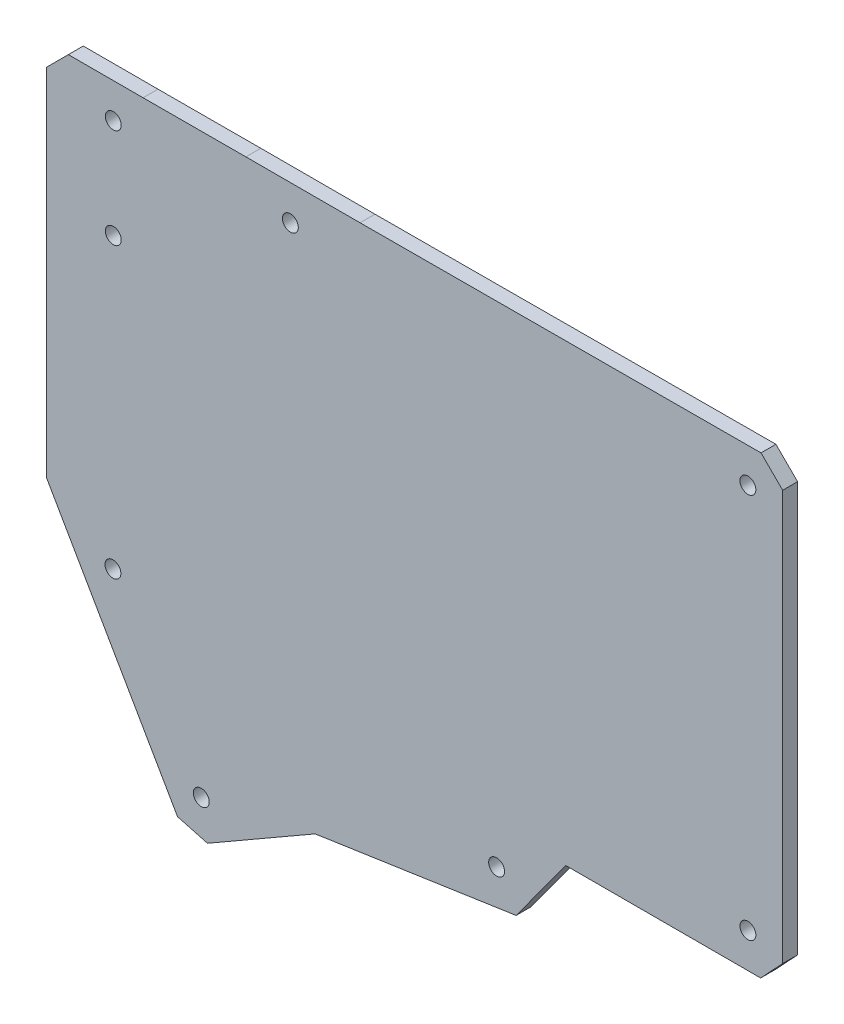
ISO-10303-21;
HEADER;
FILE_DESCRIPTION(('STEP AP214'),'2;1');
FILE_NAME('part.step','',(''),(''),'','','');
FILE_SCHEMA(('AUTOMOTIVE_DESIGN { 1 0 10303 214 1 1 1 1 }'));
ENDSEC;
DATA;
#1=APPLICATION_CONTEXT('core data for automotive mechanical design processes');
#2=APPLICATION_PROTOCOL_DEFINITION('international standard','automotive_design',2000,#1);
#3=PRODUCT_CONTEXT('',#1,'mechanical');
#4=PRODUCT('Part','Part','',(#3));
#5=PRODUCT_RELATED_PRODUCT_CATEGORY('part','',(#4));
#6=PRODUCT_DEFINITION_FORMATION('','',#4);
#7=PRODUCT_DEFINITION_CONTEXT('part definition',#1,'design');
#8=PRODUCT_DEFINITION('design','',#6,#7);
#9=PRODUCT_DEFINITION_SHAPE('','',#8);
#10=(LENGTH_UNIT() NAMED_UNIT(*) SI_UNIT(.MILLI.,.METRE.));
#11=(NAMED_UNIT(*) PLANE_ANGLE_UNIT() SI_UNIT($,.RADIAN.));
#12=(NAMED_UNIT(*) SI_UNIT($,.STERADIAN.) SOLID_ANGLE_UNIT());
#13=UNCERTAINTY_MEASURE_WITH_UNIT(LENGTH_MEASURE(1.E-05),#10,'distance_accuracy_value','');
#14=(GEOMETRIC_REPRESENTATION_CONTEXT(3) GLOBAL_UNCERTAINTY_ASSIGNED_CONTEXT((#13)) GLOBAL_UNIT_ASSIGNED_CONTEXT((#10,
#11,#12)) REPRESENTATION_CONTEXT('',''));
#15=CARTESIAN_POINT('',(0.,0.,0.));
#16=DIRECTION('',(0.,0.,1.));
#17=DIRECTION('',(1.,0.,0.));
#18=AXIS2_PLACEMENT_3D('',#15,#16,#17);
#19=CARTESIAN_POINT('',(-11.3391069607443,0.,3.));
#20=DIRECTION('',(-1.,0.,0.));
#21=DIRECTION('',(0.,0.,1.));
#22=AXIS2_PLACEMENT_3D('',#19,#20,#21);
#23=PLANE('',#22);
#24=DIRECTION('',(0.,1.,0.));
#25=VECTOR('',#24,1.);
#26=CARTESIAN_POINT('',(-11.3391069607443,0.,0.));
#27=LINE('',#26,#25);
#28=CARTESIAN_POINT('',(-11.3391069607444,-81.1960721287899,0.));
#29=VERTEX_POINT('',#28);
#30=CARTESIAN_POINT('',(-11.3391069607443,1.26724378586505,0.));
#31=VERTEX_POINT('',#30);
#32=EDGE_CURVE('E199',#29,#31,#27,.T.);
#33=ORIENTED_EDGE('',*,*,#32,.T.);
#34=DIRECTION('',(0.,0.,-1.));
#35=VECTOR('',#34,1.);
#36=CARTESIAN_POINT('',(-11.3391069607443,1.26724378586505,3.));
#37=LINE('',#36,#35);
#38=CARTESIAN_POINT('',(-11.3391069607443,1.26724378586505,3.));
#39=VERTEX_POINT('',#38);
#40=EDGE_CURVE('E11',#39,#31,#37,.T.);
#41=ORIENTED_EDGE('',*,*,#40,.F.);
#42=DIRECTION('',(0.,1.,0.));
#43=VECTOR('',#42,1.);
#44=CARTESIAN_POINT('',(-11.3391069607443,0.,3.));
#45=LINE('',#44,#43);
#46=CARTESIAN_POINT('',(-11.3391069607444,-81.1960721287899,3.));
#47=VERTEX_POINT('',#46);
#48=EDGE_CURVE('E601',#47,#39,#45,.T.);
#49=ORIENTED_EDGE('',*,*,#48,.F.);
#50=DIRECTION('',(0.,0.,-1.));
#51=VECTOR('',#50,1.);
#52=CARTESIAN_POINT('',(-11.3391069607444,-81.1960721287899,3.));
#53=LINE('',#52,#51);
#54=EDGE_CURVE('E52',#47,#29,#53,.T.);
#55=ORIENTED_EDGE('',*,*,#54,.T.);
#56=EDGE_LOOP('',(#33,#41,#49,#55));
#57=FACE_BOUND('',#56,.T.);
#58=ADVANCED_FACE('F35',(#57),#23,.F.);
#59=CARTESIAN_POINT('',(-5.01875923362706,-5.03398608737161,3.));
#60=DIRECTION('',(-0.706034919401093,-0.708177020656765,0.));
#61=DIRECTION('',(0.708177020656765,-0.706034919401093,0.));
#62=AXIS2_PLACEMENT_3D('',#59,#60,#61);
#63=PLANE('',#62);
#64=DIRECTION('',(-0.708177020656765,0.706034919401093,0.));
#65=VECTOR('',#64,1.);
#66=CARTESIAN_POINT('',(-5.01875923362706,-5.03398608737161,0.));
#67=LINE('',#66,#65);
#68=CARTESIAN_POINT('',(-15.6935955382785,5.60856086082619,0.));
#69=VERTEX_POINT('',#68);
#70=EDGE_CURVE('E201',#31,#69,#67,.T.);
#71=ORIENTED_EDGE('',*,*,#70,.T.);
#72=DIRECTION('',(0.,0.,-1.));
#73=VECTOR('',#72,1.);
#74=CARTESIAN_POINT('',(-15.6935955382785,5.60856086082619,3.));
#75=LINE('',#74,#73);
#76=CARTESIAN_POINT('',(-15.6935955382785,5.60856086082619,3.));
#77=VERTEX_POINT('',#76);
#78=EDGE_CURVE('E44',#77,#69,#75,.T.);
#79=ORIENTED_EDGE('',*,*,#78,.F.);
#80=DIRECTION('',(-0.708177020656765,0.706034919401093,0.));
#81=VECTOR('',#80,1.);
#82=CARTESIAN_POINT('',(-5.01875923362706,-5.03398608737161,3.));
#83=LINE('',#82,#81);
#84=EDGE_CURVE('E111',#39,#77,#83,.T.);
#85=ORIENTED_EDGE('',*,*,#84,.F.);
#86=ORIENTED_EDGE('',*,*,#40,.T.);
#87=EDGE_LOOP('',(#71,#79,#85,#86));
#88=FACE_BOUND('',#87,.T.);
#89=ADVANCED_FACE('F319',(#88),#63,.F.);
#90=CARTESIAN_POINT('',(-0.0171344360139464,5.65605111756165,3.));
#91=DIRECTION('',(0.00302938517258272,-0.99999541140221,0.));
#92=DIRECTION('',(0.99999541140221,0.00302938517258272,0.));
#93=AXIS2_PLACEMENT_3D('',#90,#91,#92);
#94=PLANE('',#93);
#95=DIRECTION('',(-0.99999541140221,-0.00302938517258272,0.));
#96=VECTOR('',#95,1.);
#97=CARTESIAN_POINT('',(-0.0171344360139464,5.65605111756165,0.));
#98=LINE('',#97,#96);
#99=CARTESIAN_POINT('',(-96.3671470307811,5.36416847869687,0.));
#100=VERTEX_POINT('',#99);
#101=EDGE_CURVE('E203',#69,#100,#98,.T.);
#102=ORIENTED_EDGE('',*,*,#101,.T.);
#103=DIRECTION('',(0.,0.,-1.));
#104=VECTOR('',#103,1.);
#105=CARTESIAN_POINT('',(-96.3671470307811,5.36416847869687,3.));
#106=LINE('',#105,#104);
#107=CARTESIAN_POINT('',(-96.3671470307811,5.36416847869687,3.));
#108=VERTEX_POINT('',#107);
#109=EDGE_CURVE('E258',#108,#100,#106,.T.);
#110=ORIENTED_EDGE('',*,*,#109,.F.);
#111=DIRECTION('',(-0.99999541140221,-0.00302938517258272,0.));
#112=VECTOR('',#111,1.);
#113=CARTESIAN_POINT('',(-0.0171344360139464,5.65605111756165,3.));
#114=LINE('',#113,#112);
#115=EDGE_CURVE('E265',#77,#108,#114,.T.);
#116=ORIENTED_EDGE('',*,*,#115,.F.);
#117=ORIENTED_EDGE('',*,*,#78,.T.);
#118=EDGE_LOOP('',(#102,#110,#116,#117));
#119=FACE_BOUND('',#118,.T.);
#120=ADVANCED_FACE('F263',(#119),#94,.F.);
#121=CARTESIAN_POINT('',(0.,5.36416847869687,3.));
#122=DIRECTION('',(0.,1.,0.));
#123=DIRECTION('',(0.,0.,1.));
#124=AXIS2_PLACEMENT_3D('',#121,#122,#123);
#125=PLANE('',#124);
#126=DIRECTION('',(1.,0.,0.));
#127=VECTOR('',#126,1.);
#128=CARTESIAN_POINT('',(0.,5.36416847869687,0.));
#129=LINE('',#128,#127);
#130=CARTESIAN_POINT('',(-119.344550333397,5.36416847869687,0.));
#131=VERTEX_POINT('',#130);
#132=EDGE_CURVE('E206',#131,#100,#129,.T.);
#133=ORIENTED_EDGE('',*,*,#132,.F.);
#134=DIRECTION('',(0.,0.,-1.));
#135=VECTOR('',#134,1.);
#136=CARTESIAN_POINT('',(-119.344550333397,5.36416847869687,3.));
#137=LINE('',#136,#135);
#138=CARTESIAN_POINT('',(-119.344550333397,5.36416847869687,3.));
#139=VERTEX_POINT('',#138);
#140=EDGE_CURVE('E256',#139,#131,#137,.T.);
#141=ORIENTED_EDGE('',*,*,#140,.F.);
#142=DIRECTION('',(1.,0.,0.));
#143=VECTOR('',#142,1.);
#144=CARTESIAN_POINT('',(0.,5.36416847869687,3.));
#145=LINE('',#144,#143);
#146=EDGE_CURVE('E275',#139,#108,#145,.T.);
#147=ORIENTED_EDGE('',*,*,#146,.T.);
#148=ORIENTED_EDGE('',*,*,#109,.T.);
#149=EDGE_LOOP('',(#133,#141,#147,#148));
#150=FACE_BOUND('',#149,.T.);
#151=ADVANCED_FACE('F272',(#150),#125,.T.);
#152=CARTESIAN_POINT('',(-0.0117608863754863,5.61415436888448,3.));
#153=DIRECTION('',(-0.00209485877957112,0.999997805780939,0.));
#154=DIRECTION('',(-0.99999780578094,-0.00209485877957112,0.));
#155=AXIS2_PLACEMENT_3D('',#152,#153,#154);
#156=PLANE('',#155);
#157=DIRECTION('',(0.99999780578094,0.00209485877957112,0.));
#158=VECTOR('',#157,1.);
#159=CARTESIAN_POINT('',(-0.0117608863754863,5.61415436888448,0.));
#160=LINE('',#159,#158);
#161=CARTESIAN_POINT('',(-140.021777649489,5.32085251247185,0.));
#162=VERTEX_POINT('',#161);
#163=EDGE_CURVE('E209',#162,#131,#160,.T.);
#164=ORIENTED_EDGE('',*,*,#163,.F.);
#165=DIRECTION('',(0.,0.,-1.));
#166=VECTOR('',#165,1.);
#167=CARTESIAN_POINT('',(-140.021777649489,5.32085251247185,3.));
#168=LINE('',#167,#166);
#169=CARTESIAN_POINT('',(-140.021777649489,5.32085251247185,3.));
#170=VERTEX_POINT('',#169);
#171=EDGE_CURVE('E254',#170,#162,#168,.T.);
#172=ORIENTED_EDGE('',*,*,#171,.F.);
#173=DIRECTION('',(0.99999780578094,0.00209485877957112,0.));
#174=VECTOR('',#173,1.);
#175=CARTESIAN_POINT('',(-0.0117608863754863,5.61415436888448,3.));
#176=LINE('',#175,#174);
#177=EDGE_CURVE('E278',#170,#139,#176,.T.);
#178=ORIENTED_EDGE('',*,*,#177,.T.);
#179=ORIENTED_EDGE('',*,*,#140,.T.);
#180=EDGE_LOOP('',(#164,#172,#178,#179));
#181=FACE_BOUND('',#180,.T.);
#182=ADVANCED_FACE('F520',(#181),#156,.T.);
#183=CARTESIAN_POINT('',(0.,5.32085251247185,3.));
#184=DIRECTION('',(0.,-1.,0.));
#185=DIRECTION('',(0.,0.,-1.));
#186=AXIS2_PLACEMENT_3D('',#183,#184,#185);
#187=PLANE('',#186);
#188=DIRECTION('',(-1.,0.,0.));
#189=VECTOR('',#188,1.);
#190=CARTESIAN_POINT('',(0.,5.32085251247185,0.));
#191=LINE('',#190,#189);
#192=CARTESIAN_POINT('',(-155.064772312705,5.32085251247185,0.));
#193=VERTEX_POINT('',#192);
#194=EDGE_CURVE('E212',#162,#193,#191,.T.);
#195=ORIENTED_EDGE('',*,*,#194,.T.);
#196=DIRECTION('',(0.,0.,-1.));
#197=VECTOR('',#196,1.);
#198=CARTESIAN_POINT('',(-155.064772312705,5.32085251247185,3.));
#199=LINE('',#198,#197);
#200=CARTESIAN_POINT('',(-155.064772312705,5.32085251247185,3.));
#201=VERTEX_POINT('',#200);
#202=EDGE_CURVE('E251',#201,#193,#199,.T.);
#203=ORIENTED_EDGE('',*,*,#202,.F.);
#204=DIRECTION('',(-1.,0.,0.));
#205=VECTOR('',#204,1.);
#206=CARTESIAN_POINT('',(0.,5.32085251247185,3.));
#207=LINE('',#206,#205);
#208=EDGE_CURVE('E280',#170,#201,#207,.T.);
#209=ORIENTED_EDGE('',*,*,#208,.F.);
#210=ORIENTED_EDGE('',*,*,#171,.T.);
#211=EDGE_LOOP('',(#195,#203,#209,#210));
#212=FACE_BOUND('',#211,.T.);
#213=ADVANCED_FACE('F510',(#212),#187,.F.);
#214=CARTESIAN_POINT('',(-80.1928124125885,80.1928124125884,3.));
#215=DIRECTION('',(0.707106781186548,-0.707106781186547,0.));
#216=DIRECTION('',(0.707106781186547,0.707106781186548,0.));
#217=AXIS2_PLACEMENT_3D('',#214,#215,#216);
#218=PLANE('',#217);
#219=DIRECTION('',(-0.707106781186547,-0.707106781186548,0.));
#220=VECTOR('',#219,1.);
#221=CARTESIAN_POINT('',(-80.1928124125885,80.1928124125884,0.));
#222=LINE('',#221,#220);
#223=CARTESIAN_POINT('',(-159.478985875078,0.906638950098765,0.));
#224=VERTEX_POINT('',#223);
#225=EDGE_CURVE('E214',#193,#224,#222,.T.);
#226=ORIENTED_EDGE('',*,*,#225,.T.);
#227=DIRECTION('',(0.,0.,-1.));
#228=VECTOR('',#227,1.);
#229=CARTESIAN_POINT('',(-159.478985875078,0.906638950098765,3.));
#230=LINE('',#229,#228);
#231=CARTESIAN_POINT('',(-159.478985875078,0.906638950098765,3.));
#232=VERTEX_POINT('',#231);
#233=EDGE_CURVE('E248',#232,#224,#230,.T.);
#234=ORIENTED_EDGE('',*,*,#233,.F.);
#235=DIRECTION('',(-0.707106781186547,-0.707106781186548,0.));
#236=VECTOR('',#235,1.);
#237=CARTESIAN_POINT('',(-80.1928124125885,80.1928124125884,3.));
#238=LINE('',#237,#236);
#239=EDGE_CURVE('E286',#201,#232,#238,.T.);
#240=ORIENTED_EDGE('',*,*,#239,.F.);
#241=ORIENTED_EDGE('',*,*,#202,.T.);
#242=EDGE_LOOP('',(#226,#234,#240,#241));
#243=FACE_BOUND('',#242,.T.);
#244=ADVANCED_FACE('F499',(#243),#218,.F.);
#245=CARTESIAN_POINT('',(-159.478985875078,0.,3.));
#246=DIRECTION('',(1.,0.,0.));
#247=DIRECTION('',(0.,0.,-1.));
#248=AXIS2_PLACEMENT_3D('',#245,#246,#247);
#249=PLANE('',#248);
#250=DIRECTION('',(0.,-1.,0.));
#251=VECTOR('',#250,1.);
#252=CARTESIAN_POINT('',(-159.478985875078,0.,0.));
#253=LINE('',#252,#251);
#254=CARTESIAN_POINT('',(-159.478985875078,-70.5743208912734,0.));
#255=VERTEX_POINT('',#254);
#256=EDGE_CURVE('E216',#224,#255,#253,.T.);
#257=ORIENTED_EDGE('',*,*,#256,.T.);
#258=DIRECTION('',(0.,0.,-1.));
#259=VECTOR('',#258,1.);
#260=CARTESIAN_POINT('',(-159.478985875078,-70.5743208912734,3.));
#261=LINE('',#260,#259);
#262=CARTESIAN_POINT('',(-159.478985875078,-70.5743208912734,3.));
#263=VERTEX_POINT('',#262);
#264=EDGE_CURVE('E245',#263,#255,#261,.T.);
#265=ORIENTED_EDGE('',*,*,#264,.F.);
#266=DIRECTION('',(0.,-1.,0.));
#267=VECTOR('',#266,1.);
#268=CARTESIAN_POINT('',(-159.478985875078,0.,3.));
#269=LINE('',#268,#267);
#270=EDGE_CURVE('E288',#232,#263,#269,.T.);
#271=ORIENTED_EDGE('',*,*,#270,.F.);
#272=ORIENTED_EDGE('',*,*,#233,.T.);
#273=EDGE_LOOP('',(#257,#265,#271,#272));
#274=FACE_BOUND('',#273,.T.);
#275=ADVANCED_FACE('F489',(#274),#249,.F.);
#276=CARTESIAN_POINT('',(-150.385282970097,-86.4021560626533,3.));
#277=DIRECTION('',(0.867079117153433,0.498170457370188,0.));
#278=DIRECTION('',(-0.498170457370188,0.867079117153434,0.));
#279=AXIS2_PLACEMENT_3D('',#276,#277,#278);
#280=PLANE('',#279);
#281=DIRECTION('',(0.498170457370188,-0.867079117153434,0.));
#282=VECTOR('',#281,1.);
#283=CARTESIAN_POINT('',(-150.385282970097,-86.4021560626533,0.));
#284=LINE('',#283,#282);
#285=CARTESIAN_POINT('',(-133.100653392858,-116.486520023682,0.));
#286=VERTEX_POINT('',#285);
#287=EDGE_CURVE('E218',#255,#286,#284,.T.);
#288=ORIENTED_EDGE('',*,*,#287,.T.);
#289=DIRECTION('',(0.,0.,-1.));
#290=VECTOR('',#289,1.);
#291=CARTESIAN_POINT('',(-133.100653392858,-116.486520023682,3.));
#292=LINE('',#291,#290);
#293=CARTESIAN_POINT('',(-133.100653392858,-116.486520023682,3.));
#294=VERTEX_POINT('',#293);
#295=EDGE_CURVE('E242',#294,#286,#292,.T.);
#296=ORIENTED_EDGE('',*,*,#295,.F.);
#297=DIRECTION('',(0.498170457370188,-0.867079117153434,0.));
#298=VECTOR('',#297,1.);
#299=CARTESIAN_POINT('',(-150.385282970097,-86.4021560626533,3.));
#300=LINE('',#299,#298);
#301=EDGE_CURVE('E290',#263,#294,#300,.T.);
#302=ORIENTED_EDGE('',*,*,#301,.F.);
#303=ORIENTED_EDGE('',*,*,#264,.T.);
#304=EDGE_LOOP('',(#288,#296,#302,#303));
#305=FACE_BOUND('',#304,.T.);
#306=ADVANCED_FACE('F479',(#305),#280,.F.);
#307=CARTESIAN_POINT('',(-38.3262179573216,-142.056284095759,3.));
#308=DIRECTION('',(0.260482277203311,0.965478629107334,0.));
#309=DIRECTION('',(-0.965478629107334,0.260482277203311,0.));
#310=AXIS2_PLACEMENT_3D('',#307,#308,#309);
#311=PLANE('',#310);
#312=DIRECTION('',(0.965478629107334,-0.260482277203311,0.));
#313=VECTOR('',#312,1.);
#314=CARTESIAN_POINT('',(-38.3262179573216,-142.056284095759,0.));
#315=LINE('',#314,#313);
#316=CARTESIAN_POINT('',(-127.076613357529,-118.111781960155,0.));
#317=VERTEX_POINT('',#316);
#318=EDGE_CURVE('E220',#286,#317,#315,.T.);
#319=ORIENTED_EDGE('',*,*,#318,.T.);
#320=DIRECTION('',(0.,0.,-1.));
#321=VECTOR('',#320,1.);
#322=CARTESIAN_POINT('',(-127.076613357529,-118.111781960155,3.));
#323=LINE('',#322,#321);
#324=CARTESIAN_POINT('',(-127.076613357529,-118.111781960155,3.));
#325=VERTEX_POINT('',#324);
#326=EDGE_CURVE('E239',#325,#317,#323,.T.);
#327=ORIENTED_EDGE('',*,*,#326,.F.);
#328=DIRECTION('',(0.965478629107334,-0.260482277203311,0.));
#329=VECTOR('',#328,1.);
#330=CARTESIAN_POINT('',(-38.3262179573216,-142.056284095759,3.));
#331=LINE('',#330,#329);
#332=EDGE_CURVE('E292',#294,#325,#331,.T.);
#333=ORIENTED_EDGE('',*,*,#332,.F.);
#334=ORIENTED_EDGE('',*,*,#295,.T.);
#335=EDGE_LOOP('',(#319,#327,#333,#334));
#336=FACE_BOUND('',#335,.T.);
#337=ADVANCED_FACE('F470',(#336),#311,.F.);
#338=CARTESIAN_POINT('',(19.4424470319471,-33.7792379449592,3.));
#339=DIRECTION('',(-0.498844869486857,0.86669129232192,0.));
#340=DIRECTION('',(-0.86669129232192,-0.498844869486857,0.));
#341=AXIS2_PLACEMENT_3D('',#338,#339,#340);
#342=PLANE('',#341);
#343=DIRECTION('',(0.86669129232192,0.498844869486857,0.));
#344=VECTOR('',#343,1.);
#345=CARTESIAN_POINT('',(19.4424470319471,-33.7792379449592,0.));
#346=LINE('',#345,#344);
#347=CARTESIAN_POINT('',(-105.412894174079,-105.642711064432,0.));
#348=VERTEX_POINT('',#347);
#349=EDGE_CURVE('E222',#317,#348,#346,.T.);
#350=ORIENTED_EDGE('',*,*,#349,.T.);
#351=DIRECTION('',(0.,0.,-1.));
#352=VECTOR('',#351,1.);
#353=CARTESIAN_POINT('',(-105.412894174079,-105.642711064432,3.));
#354=LINE('',#353,#352);
#355=CARTESIAN_POINT('',(-105.412894174079,-105.642711064432,3.));
#356=VERTEX_POINT('',#355);
#357=EDGE_CURVE('E236',#356,#348,#354,.T.);
#358=ORIENTED_EDGE('',*,*,#357,.F.);
#359=DIRECTION('',(0.86669129232192,0.498844869486857,0.));
#360=VECTOR('',#359,1.);
#361=CARTESIAN_POINT('',(19.4424470319471,-33.7792379449592,3.));
#362=LINE('',#361,#360);
#363=EDGE_CURVE('E294',#325,#356,#362,.T.);
#364=ORIENTED_EDGE('',*,*,#363,.F.);
#365=ORIENTED_EDGE('',*,*,#326,.T.);
#366=EDGE_LOOP('',(#350,#358,#364,#365));
#367=FACE_BOUND('',#366,.T.);
#368=ADVANCED_FACE('F300',(#367),#342,.F.);
#369=CARTESIAN_POINT('',(13.0852967169432,-88.0280539294065,3.));
#370=DIRECTION('',(-0.147033571925685,0.989131502241625,0.));
#371=DIRECTION('',(-0.989131502241625,-0.147033571925685,0.));
#372=AXIS2_PLACEMENT_3D('',#369,#370,#371);
#373=PLANE('',#372);
#374=DIRECTION('',(0.989131502241625,0.147033571925685,0.));
#375=VECTOR('',#374,1.);
#376=CARTESIAN_POINT('',(13.0852967169432,-88.0280539294065,0.));
#377=LINE('',#376,#375);
#378=CARTESIAN_POINT('',(-64.9706233499997,-99.6310012740001,0.));
#379=VERTEX_POINT('',#378);
#380=EDGE_CURVE('E224',#348,#379,#377,.T.);
#381=ORIENTED_EDGE('',*,*,#380,.T.);
#382=DIRECTION('',(0.,0.,-1.));
#383=VECTOR('',#382,1.);
#384=CARTESIAN_POINT('',(-64.9706233499997,-99.6310012740001,3.));
#385=LINE('',#384,#383);
#386=CARTESIAN_POINT('',(-64.9706233499997,-99.6310012740001,3.));
#387=VERTEX_POINT('',#386);
#388=EDGE_CURVE('E167',#387,#379,#385,.T.);
#389=ORIENTED_EDGE('',*,*,#388,.F.);
#390=DIRECTION('',(0.989131502241625,0.147033571925685,0.));
#391=VECTOR('',#390,1.);
#392=CARTESIAN_POINT('',(13.0852967169432,-88.0280539294065,3.));
#393=LINE('',#392,#391);
#394=EDGE_CURVE('E155',#356,#387,#393,.T.);
#395=ORIENTED_EDGE('',*,*,#394,.F.);
#396=ORIENTED_EDGE('',*,*,#357,.T.);
#397=EDGE_LOOP('',(#381,#389,#395,#396));
#398=FACE_BOUND('',#397,.T.);
#399=ADVANCED_FACE('F304',(#398),#373,.F.);
#400=CARTESIAN_POINT('',(5.06145758509057,-3.6947927449223,3.));
#401=DIRECTION('',(-0.807692408581894,0.589604081667672,0.));
#402=DIRECTION('',(-0.589604081667672,-0.807692408581894,0.));
#403=AXIS2_PLACEMENT_3D('',#400,#401,#402);
#404=PLANE('',#403);
#405=DIRECTION('',(0.589604081667672,0.807692408581894,0.));
#406=VECTOR('',#405,1.);
#407=CARTESIAN_POINT('',(5.06145758509057,-3.6947927449223,0.));
#408=LINE('',#407,#406);
#409=CARTESIAN_POINT('',(-54.9717380120555,-85.9336337814013,0.));
#410=VERTEX_POINT('',#409);
#411=EDGE_CURVE('E164',#379,#410,#408,.T.);
#412=ORIENTED_EDGE('',*,*,#411,.T.);
#413=DIRECTION('',(0.,0.,-1.));
#414=VECTOR('',#413,1.);
#415=CARTESIAN_POINT('',(-54.9717380120555,-85.9336337814013,3.));
#416=LINE('',#415,#414);
#417=CARTESIAN_POINT('',(-54.9717380120555,-85.9336337814013,3.));
#418=VERTEX_POINT('',#417);
#419=EDGE_CURVE('E161',#418,#410,#416,.T.);
#420=ORIENTED_EDGE('',*,*,#419,.F.);
#421=DIRECTION('',(0.589604081667672,0.807692408581894,0.));
#422=VECTOR('',#421,1.);
#423=CARTESIAN_POINT('',(5.06145758509057,-3.6947927449223,3.));
#424=LINE('',#423,#422);
#425=EDGE_CURVE('E148',#387,#418,#424,.T.);
#426=ORIENTED_EDGE('',*,*,#425,.F.);
#427=ORIENTED_EDGE('',*,*,#388,.T.);
#428=EDGE_LOOP('',(#412,#420,#426,#427));
#429=FACE_BOUND('',#428,.T.);
#430=ADVANCED_FACE('F162',(#429),#404,.F.);
#431=CARTESIAN_POINT('',(0.,-85.9336337814013,3.));
#432=DIRECTION('',(0.,-1.,0.));
#433=DIRECTION('',(0.,0.,-1.));
#434=AXIS2_PLACEMENT_3D('',#431,#432,#433);
#435=PLANE('',#434);
#436=DIRECTION('',(-1.,0.,0.));
#437=VECTOR('',#436,1.);
#438=CARTESIAN_POINT('',(0.,-85.9336337814013,0.));
#439=LINE('',#438,#437);
#440=CARTESIAN_POINT('',(-15.7728542969137,-85.9336337814013,0.));
#441=VERTEX_POINT('',#440);
#442=EDGE_CURVE('E227',#441,#410,#439,.T.);
#443=ORIENTED_EDGE('',*,*,#442,.F.);
#444=DIRECTION('',(0.,0.,-1.));
#445=VECTOR('',#444,1.);
#446=CARTESIAN_POINT('',(-15.7728542969137,-85.9336337814013,3.));
#447=LINE('',#446,#445);
#448=CARTESIAN_POINT('',(-15.7728542969137,-85.9336337814013,3.));
#449=VERTEX_POINT('',#448);
#450=EDGE_CURVE('E99',#449,#441,#447,.T.);
#451=ORIENTED_EDGE('',*,*,#450,.F.);
#452=DIRECTION('',(-1.,0.,0.));
#453=VECTOR('',#452,1.);
#454=CARTESIAN_POINT('',(0.,-85.9336337814013,3.));
#455=LINE('',#454,#453);
#456=EDGE_CURVE('E153',#449,#418,#455,.T.);
#457=ORIENTED_EDGE('',*,*,#456,.T.);
#458=ORIENTED_EDGE('',*,*,#419,.T.);
#459=EDGE_LOOP('',(#443,#451,#457,#458));
#460=FACE_BOUND('',#459,.T.);
#461=ADVANCED_FACE('F169',(#460),#435,.T.);
#462=CARTESIAN_POINT('',(-18.3391069607443,-1.34192698696502,3.));
#463=DIRECTION('',(0.,0.,-1.));
#464=DIRECTION('',(-1.,0.,0.));
#465=AXIS2_PLACEMENT_3D('',#462,#463,#464);
#466=CYLINDRICAL_SURFACE('',#465,1.6);
#467=CARTESIAN_POINT('',(-18.3391069607443,-1.34192698696502,3.));
#468=DIRECTION('',(0.,0.,1.));
#469=DIRECTION('',(1.,0.,0.));
#470=AXIS2_PLACEMENT_3D('',#467,#468,#469);
#471=CIRCLE('',#470,1.6);
#472=CARTESIAN_POINT('',(-16.7391069607443,-1.34192698696502,3.));
#473=VERTEX_POINT('',#472);
#474=EDGE_CURVE('E598',#473,#473,#471,.T.);
#475=ORIENTED_EDGE('',*,*,#474,.T.);
#476=EDGE_LOOP('',(#475));
#477=FACE_BOUND('',#476,.T.);
#478=CARTESIAN_POINT('',(-18.3391069607443,-1.34192698696502,0.));
#479=DIRECTION('',(0.,0.,1.));
#480=DIRECTION('',(1.,0.,0.));
#481=AXIS2_PLACEMENT_3D('',#478,#479,#480);
#482=CIRCLE('',#481,1.6);
#483=CARTESIAN_POINT('',(-16.7391069607443,-1.34192698696502,0.));
#484=VERTEX_POINT('',#483);
#485=EDGE_CURVE('E196',#484,#484,#482,.T.);
#486=ORIENTED_EDGE('',*,*,#485,.F.);
#487=EDGE_LOOP('',(#486));
#488=FACE_BOUND('',#487,.T.);
#489=ADVANCED_FACE('F327',(#477,#488),#466,.F.);
#490=CARTESIAN_POINT('',(-110.397084987784,-1.67836592268011,3.));
#491=DIRECTION('',(0.,0.,-1.));
#492=DIRECTION('',(-1.,0.,0.));
#493=AXIS2_PLACEMENT_3D('',#490,#491,#492);
#494=CYLINDRICAL_SURFACE('',#493,1.60000000000001);
#495=CARTESIAN_POINT('',(-110.397084987784,-1.67836592268011,3.));
#496=DIRECTION('',(0.,0.,1.));
#497=DIRECTION('',(1.,0.,0.));
#498=AXIS2_PLACEMENT_3D('',#495,#496,#497);
#499=CIRCLE('',#498,1.60000000000001);
#500=CARTESIAN_POINT('',(-108.797084987784,-1.67836592268011,3.));
#501=VERTEX_POINT('',#500);
#502=EDGE_CURVE('E595',#501,#501,#499,.T.);
#503=ORIENTED_EDGE('',*,*,#502,.T.);
#504=EDGE_LOOP('',(#503));
#505=FACE_BOUND('',#504,.T.);
#506=CARTESIAN_POINT('',(-110.397084987784,-1.67836592268011,0.));
#507=DIRECTION('',(0.,0.,1.));
#508=DIRECTION('',(1.,0.,0.));
#509=AXIS2_PLACEMENT_3D('',#506,#507,#508);
#510=CIRCLE('',#509,1.60000000000001);
#511=CARTESIAN_POINT('',(-108.797084987784,-1.67836592268011,0.));
#512=VERTEX_POINT('',#511);
#513=EDGE_CURVE('E193',#512,#512,#510,.T.);
#514=ORIENTED_EDGE('',*,*,#513,.F.);
#515=EDGE_LOOP('',(#514));
#516=FACE_BOUND('',#515,.T.);
#517=ADVANCED_FACE('F330',(#505,#516),#494,.F.);
#518=CARTESIAN_POINT('',(-18.3391069607441,-78.9336337814017,3.));
#519=DIRECTION('',(0.,0.,-1.));
#520=DIRECTION('',(-1.,0.,0.));
#521=AXIS2_PLACEMENT_3D('',#518,#519,#520);
#522=CYLINDRICAL_SURFACE('',#521,1.6);
#523=CARTESIAN_POINT('',(-18.3391069607441,-78.9336337814017,3.));
#524=DIRECTION('',(0.,0.,1.));
#525=DIRECTION('',(1.,0.,0.));
#526=AXIS2_PLACEMENT_3D('',#523,#524,#525);
#527=CIRCLE('',#526,1.6);
#528=CARTESIAN_POINT('',(-16.7391069607441,-78.9336337814017,3.));
#529=VERTEX_POINT('',#528);
#530=EDGE_CURVE('E592',#529,#529,#527,.T.);
#531=ORIENTED_EDGE('',*,*,#530,.T.);
#532=EDGE_LOOP('',(#531));
#533=FACE_BOUND('',#532,.T.);
#534=CARTESIAN_POINT('',(-18.3391069607441,-78.9336337814017,0.));
#535=DIRECTION('',(0.,0.,1.));
#536=DIRECTION('',(1.,0.,0.));
#537=AXIS2_PLACEMENT_3D('',#534,#535,#536);
#538=CIRCLE('',#537,1.6);
#539=CARTESIAN_POINT('',(-16.7391069607441,-78.9336337814017,0.));
#540=VERTEX_POINT('',#539);
#541=EDGE_CURVE('E190',#540,#540,#538,.T.);
#542=ORIENTED_EDGE('',*,*,#541,.F.);
#543=EDGE_LOOP('',(#542));
#544=FACE_BOUND('',#543,.T.);
#545=ADVANCED_FACE('F334',(#533,#544),#522,.F.);
#546=CARTESIAN_POINT('',(-68.8973348654548,-93.1377882225448,3.));
#547=DIRECTION('',(0.,0.,-1.));
#548=DIRECTION('',(-1.,0.,0.));
#549=AXIS2_PLACEMENT_3D('',#546,#547,#548);
#550=CYLINDRICAL_SURFACE('',#549,1.60000000000001);
#551=CARTESIAN_POINT('',(-68.8973348654548,-93.1377882225448,3.));
#552=DIRECTION('',(0.,0.,1.));
#553=DIRECTION('',(1.,0.,0.));
#554=AXIS2_PLACEMENT_3D('',#551,#552,#553);
#555=CIRCLE('',#554,1.60000000000001);
#556=CARTESIAN_POINT('',(-67.2973348654548,-93.1377882225448,3.));
#557=VERTEX_POINT('',#556);
#558=EDGE_CURVE('E589',#557,#557,#555,.T.);
#559=ORIENTED_EDGE('',*,*,#558,.T.);
#560=EDGE_LOOP('',(#559));
#561=FACE_BOUND('',#560,.T.);
#562=CARTESIAN_POINT('',(-68.8973348654548,-93.1377882225448,0.));
#563=DIRECTION('',(0.,0.,1.));
#564=DIRECTION('',(1.,0.,0.));
#565=AXIS2_PLACEMENT_3D('',#562,#563,#564);
#566=CIRCLE('',#565,1.60000000000001);
#567=CARTESIAN_POINT('',(-67.2973348654548,-93.1377882225448,0.));
#568=VERTEX_POINT('',#567);
#569=EDGE_CURVE('E187',#568,#568,#566,.T.);
#570=ORIENTED_EDGE('',*,*,#569,.F.);
#571=EDGE_LOOP('',(#570));
#572=FACE_BOUND('',#571,.T.);
#573=ADVANCED_FACE('F338',(#561,#572),#550,.F.);
#574=CARTESIAN_POINT('',(-128.322250167988,-110.752044387657,3.));
#575=DIRECTION('',(0.,0.,-1.));
#576=DIRECTION('',(-1.,0.,0.));
#577=AXIS2_PLACEMENT_3D('',#574,#575,#576);
#578=CYLINDRICAL_SURFACE('',#577,1.59999999999999);
#579=CARTESIAN_POINT('',(-128.322250167988,-110.752044387657,3.));
#580=DIRECTION('',(0.,0.,1.));
#581=DIRECTION('',(1.,0.,0.));
#582=AXIS2_PLACEMENT_3D('',#579,#580,#581);
#583=CIRCLE('',#582,1.59999999999999);
#584=CARTESIAN_POINT('',(-126.722250167988,-110.752044387657,3.));
#585=VERTEX_POINT('',#584);
#586=EDGE_CURVE('E582',#585,#585,#583,.T.);
#587=ORIENTED_EDGE('',*,*,#586,.T.);
#588=EDGE_LOOP('',(#587));
#589=FACE_BOUND('',#588,.T.);
#590=CARTESIAN_POINT('',(-128.322250167988,-110.752044387657,0.));
#591=DIRECTION('',(0.,0.,1.));
#592=DIRECTION('',(1.,0.,0.));
#593=AXIS2_PLACEMENT_3D('',#590,#591,#592);
#594=CIRCLE('',#593,1.59999999999999);
#595=CARTESIAN_POINT('',(-126.722250167988,-110.752044387657,0.));
#596=VERTEX_POINT('',#595);
#597=EDGE_CURVE('E184',#596,#596,#594,.T.);
#598=ORIENTED_EDGE('',*,*,#597,.F.);
#599=EDGE_LOOP('',(#598));
#600=FACE_BOUND('',#599,.T.);
#601=ADVANCED_FACE('F342',(#589,#600),#578,.F.);
#602=CARTESIAN_POINT('',(-146.092378900102,-79.8226560532257,3.));
#603=DIRECTION('',(0.,0.,-1.));
#604=DIRECTION('',(-1.,0.,0.));
#605=AXIS2_PLACEMENT_3D('',#602,#603,#604);
#606=CYLINDRICAL_SURFACE('',#605,1.59999999999999);
#607=CARTESIAN_POINT('',(-146.092378900102,-79.8226560532257,3.));
#608=DIRECTION('',(0.,0.,1.));
#609=DIRECTION('',(1.,0.,0.));
#610=AXIS2_PLACEMENT_3D('',#607,#608,#609);
#611=CIRCLE('',#610,1.59999999999999);
#612=CARTESIAN_POINT('',(-144.492378900102,-79.8226560532257,3.));
#613=VERTEX_POINT('',#612);
#614=EDGE_CURVE('E579',#613,#613,#611,.T.);
#615=ORIENTED_EDGE('',*,*,#614,.T.);
#616=EDGE_LOOP('',(#615));
#617=FACE_BOUND('',#616,.T.);
#618=CARTESIAN_POINT('',(-146.092378900102,-79.8226560532257,0.));
#619=DIRECTION('',(0.,0.,1.));
#620=DIRECTION('',(1.,0.,0.));
#621=AXIS2_PLACEMENT_3D('',#618,#619,#620);
#622=CIRCLE('',#621,1.59999999999999);
#623=CARTESIAN_POINT('',(-144.492378900102,-79.8226560532257,0.));
#624=VERTEX_POINT('',#623);
#625=EDGE_CURVE('E181',#624,#624,#622,.T.);
#626=ORIENTED_EDGE('',*,*,#625,.F.);
#627=EDGE_LOOP('',(#626));
#628=FACE_BOUND('',#627,.T.);
#629=ADVANCED_FACE('F346',(#617,#628),#606,.F.);
#630=CARTESIAN_POINT('',(-146.022825080028,-1.67786818578665,3.));
#631=DIRECTION('',(0.,0.,-1.));
#632=DIRECTION('',(-1.,0.,0.));
#633=AXIS2_PLACEMENT_3D('',#630,#631,#632);
#634=CYLINDRICAL_SURFACE('',#633,1.59999999999999);
#635=CARTESIAN_POINT('',(-146.022825080028,-1.67786818578665,3.));
#636=DIRECTION('',(0.,0.,1.));
#637=DIRECTION('',(1.,0.,0.));
#638=AXIS2_PLACEMENT_3D('',#635,#636,#637);
#639=CIRCLE('',#638,1.59999999999999);
#640=CARTESIAN_POINT('',(-144.422825080028,-1.67786818578665,3.));
#641=VERTEX_POINT('',#640);
#642=EDGE_CURVE('E357',#641,#641,#639,.T.);
#643=ORIENTED_EDGE('',*,*,#642,.T.);
#644=EDGE_LOOP('',(#643));
#645=FACE_BOUND('',#644,.T.);
#646=CARTESIAN_POINT('',(-146.022825080028,-1.67786818578665,0.));
#647=DIRECTION('',(0.,0.,1.));
#648=DIRECTION('',(1.,0.,0.));
#649=AXIS2_PLACEMENT_3D('',#646,#647,#648);
#650=CIRCLE('',#649,1.59999999999999);
#651=CARTESIAN_POINT('',(-144.422825080028,-1.67786818578665,0.));
#652=VERTEX_POINT('',#651);
#653=EDGE_CURVE('E178',#652,#652,#650,.T.);
#654=ORIENTED_EDGE('',*,*,#653,.F.);
#655=EDGE_LOOP('',(#654));
#656=FACE_BOUND('',#655,.T.);
#657=ADVANCED_FACE('F314',(#645,#656),#634,.F.);
#658=CARTESIAN_POINT('',(-146.022825080028,-21.6778681857867,3.));
#659=DIRECTION('',(0.,0.,-1.));
#660=DIRECTION('',(-1.,0.,0.));
#661=AXIS2_PLACEMENT_3D('',#658,#659,#660);
#662=CYLINDRICAL_SURFACE('',#661,1.59999999999999);
#663=CARTESIAN_POINT('',(-146.022825080028,-21.6778681857867,3.));
#664=DIRECTION('',(0.,0.,1.));
#665=DIRECTION('',(1.,0.,0.));
#666=AXIS2_PLACEMENT_3D('',#663,#664,#665);
#667=CIRCLE('',#666,1.59999999999999);
#668=CARTESIAN_POINT('',(-144.422825080028,-21.6778681857867,3.));
#669=VERTEX_POINT('',#668);
#670=EDGE_CURVE('E232',#669,#669,#667,.T.);
#671=ORIENTED_EDGE('',*,*,#670,.T.);
#672=EDGE_LOOP('',(#671));
#673=FACE_BOUND('',#672,.T.);
#674=CARTESIAN_POINT('',(-146.022825080028,-21.6778681857867,0.));
#675=DIRECTION('',(0.,0.,1.));
#676=DIRECTION('',(1.,0.,0.));
#677=AXIS2_PLACEMENT_3D('',#674,#675,#676);
#678=CIRCLE('',#677,1.59999999999999);
#679=CARTESIAN_POINT('',(-144.422825080028,-21.6778681857867,0.));
#680=VERTEX_POINT('',#679);
#681=EDGE_CURVE('E175',#680,#680,#678,.T.);
#682=ORIENTED_EDGE('',*,*,#681,.F.);
#683=EDGE_LOOP('',(#682));
#684=FACE_BOUND('',#683,.T.);
#685=ADVANCED_FACE('F37',(#673,#684),#662,.F.);
#686=CARTESIAN_POINT('',(34.4642636198759,-32.2541104944642,3.));
#687=DIRECTION('',(0.730130324767502,-0.683307916575611,0.));
#688=DIRECTION('',(0.683307916575611,0.730130324767502,0.));
#689=AXIS2_PLACEMENT_3D('',#686,#687,#688);
#690=PLANE('',#689);
#691=DIRECTION('',(-0.683307916575611,-0.730130324767502,0.));
#692=VECTOR('',#691,1.);
#693=CARTESIAN_POINT('',(34.4642636198759,-32.2541104944642,0.));
#694=LINE('',#693,#692);
#695=EDGE_CURVE('E229',#29,#441,#694,.T.);
#696=ORIENTED_EDGE('',*,*,#695,.F.);
#697=ORIENTED_EDGE('',*,*,#54,.F.);
#698=DIRECTION('',(-0.683307916575611,-0.730130324767502,0.));
#699=VECTOR('',#698,1.);
#700=CARTESIAN_POINT('',(34.4642636198759,-32.2541104944642,3.));
#701=LINE('',#700,#699);
#702=EDGE_CURVE('E170',#47,#449,#701,.T.);
#703=ORIENTED_EDGE('',*,*,#702,.T.);
#704=ORIENTED_EDGE('',*,*,#450,.T.);
#705=EDGE_LOOP('',(#696,#697,#703,#704));
#706=FACE_BOUND('',#705,.T.);
#707=ADVANCED_FACE('F305',(#706),#690,.T.);
#708=CARTESIAN_POINT('',(0.,0.,3.));
#709=DIRECTION('',(0.,0.,1.));
#710=DIRECTION('',(1.,0.,0.));
#711=AXIS2_PLACEMENT_3D('',#708,#709,#710);
#712=PLANE('',#711);
#713=ORIENTED_EDGE('',*,*,#670,.F.);
#714=EDGE_LOOP('',(#713));
#715=FACE_BOUND('',#714,.T.);
#716=ORIENTED_EDGE('',*,*,#642,.F.);
#717=EDGE_LOOP('',(#716));
#718=FACE_BOUND('',#717,.T.);
#719=ORIENTED_EDGE('',*,*,#614,.F.);
#720=EDGE_LOOP('',(#719));
#721=FACE_BOUND('',#720,.T.);
#722=ORIENTED_EDGE('',*,*,#586,.F.);
#723=EDGE_LOOP('',(#722));
#724=FACE_BOUND('',#723,.T.);
#725=ORIENTED_EDGE('',*,*,#558,.F.);
#726=EDGE_LOOP('',(#725));
#727=FACE_BOUND('',#726,.T.);
#728=ORIENTED_EDGE('',*,*,#530,.F.);
#729=EDGE_LOOP('',(#728));
#730=FACE_BOUND('',#729,.T.);
#731=ORIENTED_EDGE('',*,*,#502,.F.);
#732=EDGE_LOOP('',(#731));
#733=FACE_BOUND('',#732,.T.);
#734=ORIENTED_EDGE('',*,*,#474,.F.);
#735=EDGE_LOOP('',(#734));
#736=FACE_BOUND('',#735,.T.);
#737=ORIENTED_EDGE('',*,*,#48,.T.);
#738=ORIENTED_EDGE('',*,*,#84,.T.);
#739=ORIENTED_EDGE('',*,*,#115,.T.);
#740=ORIENTED_EDGE('',*,*,#146,.F.);
#741=ORIENTED_EDGE('',*,*,#177,.F.);
#742=ORIENTED_EDGE('',*,*,#208,.T.);
#743=ORIENTED_EDGE('',*,*,#239,.T.);
#744=ORIENTED_EDGE('',*,*,#270,.T.);
#745=ORIENTED_EDGE('',*,*,#301,.T.);
#746=ORIENTED_EDGE('',*,*,#332,.T.);
#747=ORIENTED_EDGE('',*,*,#363,.T.);
#748=ORIENTED_EDGE('',*,*,#394,.T.);
#749=ORIENTED_EDGE('',*,*,#425,.T.);
#750=ORIENTED_EDGE('',*,*,#456,.F.);
#751=ORIENTED_EDGE('',*,*,#702,.F.);
#752=EDGE_LOOP('',(#737,#738,#739,#740,#741,#742,#743,#744,#745,#746,#747,#748,#749,#750,#751));
#753=FACE_BOUND('',#752,.T.);
#754=ADVANCED_FACE('F150',(#715,#718,#721,#724,#727,#730,#733,#736,#753),#712,.T.);
#755=CARTESIAN_POINT('',(0.,0.,0.));
#756=DIRECTION('',(0.,0.,1.));
#757=DIRECTION('',(1.,0.,0.));
#758=AXIS2_PLACEMENT_3D('',#755,#756,#757);
#759=PLANE('',#758);
#760=ORIENTED_EDGE('',*,*,#681,.T.);
#761=EDGE_LOOP('',(#760));
#762=FACE_BOUND('',#761,.T.);
#763=ORIENTED_EDGE('',*,*,#653,.T.);
#764=EDGE_LOOP('',(#763));
#765=FACE_BOUND('',#764,.T.);
#766=ORIENTED_EDGE('',*,*,#625,.T.);
#767=EDGE_LOOP('',(#766));
#768=FACE_BOUND('',#767,.T.);
#769=ORIENTED_EDGE('',*,*,#597,.T.);
#770=EDGE_LOOP('',(#769));
#771=FACE_BOUND('',#770,.T.);
#772=ORIENTED_EDGE('',*,*,#569,.T.);
#773=EDGE_LOOP('',(#772));
#774=FACE_BOUND('',#773,.T.);
#775=ORIENTED_EDGE('',*,*,#541,.T.);
#776=EDGE_LOOP('',(#775));
#777=FACE_BOUND('',#776,.T.);
#778=ORIENTED_EDGE('',*,*,#513,.T.);
#779=EDGE_LOOP('',(#778));
#780=FACE_BOUND('',#779,.T.);
#781=ORIENTED_EDGE('',*,*,#485,.T.);
#782=EDGE_LOOP('',(#781));
#783=FACE_BOUND('',#782,.T.);
#784=ORIENTED_EDGE('',*,*,#32,.F.);
#785=ORIENTED_EDGE('',*,*,#695,.T.);
#786=ORIENTED_EDGE('',*,*,#442,.T.);
#787=ORIENTED_EDGE('',*,*,#411,.F.);
#788=ORIENTED_EDGE('',*,*,#380,.F.);
#789=ORIENTED_EDGE('',*,*,#349,.F.);
#790=ORIENTED_EDGE('',*,*,#318,.F.);
#791=ORIENTED_EDGE('',*,*,#287,.F.);
#792=ORIENTED_EDGE('',*,*,#256,.F.);
#793=ORIENTED_EDGE('',*,*,#225,.F.);
#794=ORIENTED_EDGE('',*,*,#194,.F.);
#795=ORIENTED_EDGE('',*,*,#163,.T.);
#796=ORIENTED_EDGE('',*,*,#132,.T.);
#797=ORIENTED_EDGE('',*,*,#101,.F.);
#798=ORIENTED_EDGE('',*,*,#70,.F.);
#799=EDGE_LOOP('',(#784,#785,#786,#787,#788,#789,#790,#791,#792,#793,#794,#795,#796,#797,#798));
#800=FACE_BOUND('',#799,.T.);
#801=ADVANCED_FACE('F267',(#762,#765,#768,#771,#774,#777,#780,#783,#800),#759,.F.);
#802=CLOSED_SHELL('',(#58,#89,#120,#151,#182,#213,#244,#275,#306,#337,#368,#399,#430,#461,#489,
#517,#545,#573,#601,#629,#657,#685,#707,#754,#801));
#803=MANIFOLD_SOLID_BREP('B2',#802);
#804=ADVANCED_BREP_SHAPE_REPRESENTATION('',(#18,#803),#14);
#805=SHAPE_DEFINITION_REPRESENTATION(#9,#804);
ENDSEC;
END-ISO-10303-21;
